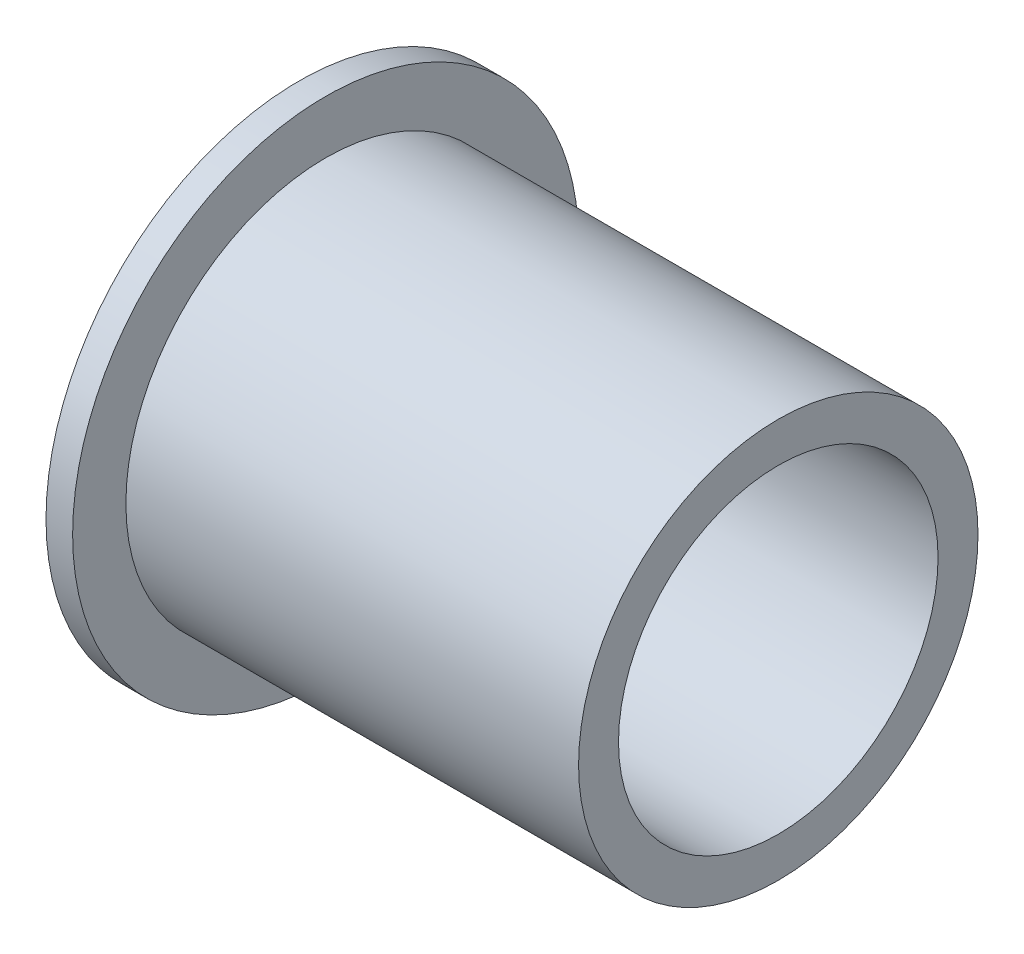
ISO-10303-21;
HEADER;
FILE_DESCRIPTION(('STEP AP214'),'2;1');
FILE_NAME('part.step','',(''),(''),'','','');
FILE_SCHEMA(('AUTOMOTIVE_DESIGN { 1 0 10303 214 1 1 1 1 }'));
ENDSEC;
DATA;
#1=APPLICATION_CONTEXT('core data for automotive mechanical design processes');
#2=APPLICATION_PROTOCOL_DEFINITION('international standard','automotive_design',2000,#1);
#3=PRODUCT_CONTEXT('',#1,'mechanical');
#4=PRODUCT('Part','Part','',(#3));
#5=PRODUCT_RELATED_PRODUCT_CATEGORY('part','',(#4));
#6=PRODUCT_DEFINITION_FORMATION('','',#4);
#7=PRODUCT_DEFINITION_CONTEXT('part definition',#1,'design');
#8=PRODUCT_DEFINITION('design','',#6,#7);
#9=PRODUCT_DEFINITION_SHAPE('','',#8);
#10=(LENGTH_UNIT() NAMED_UNIT(*) SI_UNIT(.MILLI.,.METRE.));
#11=(NAMED_UNIT(*) PLANE_ANGLE_UNIT() SI_UNIT($,.RADIAN.));
#12=(NAMED_UNIT(*) SI_UNIT($,.STERADIAN.) SOLID_ANGLE_UNIT());
#13=UNCERTAINTY_MEASURE_WITH_UNIT(LENGTH_MEASURE(1.E-05),#10,'distance_accuracy_value','');
#14=(GEOMETRIC_REPRESENTATION_CONTEXT(3) GLOBAL_UNCERTAINTY_ASSIGNED_CONTEXT((#13)) GLOBAL_UNIT_ASSIGNED_CONTEXT((#10,
#11,#12)) REPRESENTATION_CONTEXT('',''));
#15=CARTESIAN_POINT('',(0.,0.,0.));
#16=DIRECTION('',(0.,0.,1.));
#17=DIRECTION('',(1.,0.,0.));
#18=AXIS2_PLACEMENT_3D('',#15,#16,#17);
#19=CARTESIAN_POINT('',(0.,11.1125,0.));
#20=DIRECTION('',(1.,0.,0.));
#21=DIRECTION('',(0.,0.,-1.));
#22=AXIS2_PLACEMENT_3D('',#19,#20,#21);
#23=PLANE('',#22);
#24=CARTESIAN_POINT('',(0.,30.1625,0.));
#25=DIRECTION('',(1.,0.,0.));
#26=DIRECTION('',(0.,0.,-1.));
#27=AXIS2_PLACEMENT_3D('',#24,#25,#26);
#28=CIRCLE('',#27,30.1625);
#29=CARTESIAN_POINT('',(0.,30.1625,-30.1625));
#30=VERTEX_POINT('',#29);
#31=EDGE_CURVE('E10',#30,#30,#28,.T.);
#32=ORIENTED_EDGE('',*,*,#31,.F.);
#33=EDGE_LOOP('',(#32));
#34=FACE_BOUND('',#33,.T.);
#35=CARTESIAN_POINT('',(0.,30.1625,0.));
#36=DIRECTION('',(1.,0.,0.));
#37=DIRECTION('',(0.,0.,-1.));
#38=AXIS2_PLACEMENT_3D('',#35,#36,#37);
#39=CIRCLE('',#38,19.05);
#40=CARTESIAN_POINT('',(0.,30.1625,-19.05));
#41=VERTEX_POINT('',#40);
#42=EDGE_CURVE('E51',#41,#41,#39,.T.);
#43=ORIENTED_EDGE('',*,*,#42,.T.);
#44=EDGE_LOOP('',(#43));
#45=FACE_BOUND('',#44,.T.);
#46=ADVANCED_FACE('F29',(#34,#45),#23,.F.);
#47=CARTESIAN_POINT('',(57.15,30.1625,0.));
#48=DIRECTION('',(1.,0.,0.));
#49=DIRECTION('',(0.,0.,-1.));
#50=AXIS2_PLACEMENT_3D('',#47,#48,#49);
#51=CYLINDRICAL_SURFACE('',#50,30.1625);
#52=CARTESIAN_POINT('',(3.175,30.1625,0.));
#53=DIRECTION('',(1.,0.,0.));
#54=DIRECTION('',(0.,0.,-1.));
#55=AXIS2_PLACEMENT_3D('',#52,#53,#54);
#56=CIRCLE('',#55,30.1625);
#57=CARTESIAN_POINT('',(3.175,30.1625,-30.1625));
#58=VERTEX_POINT('',#57);
#59=EDGE_CURVE('E35',#58,#58,#56,.T.);
#60=ORIENTED_EDGE('',*,*,#59,.F.);
#61=EDGE_LOOP('',(#60));
#62=FACE_BOUND('',#61,.T.);
#63=ORIENTED_EDGE('',*,*,#31,.T.);
#64=EDGE_LOOP('',(#63));
#65=FACE_BOUND('',#64,.T.);
#66=ADVANCED_FACE('F76',(#62,#65),#51,.T.);
#67=CARTESIAN_POINT('',(3.175,0.,0.));
#68=DIRECTION('',(-1.,0.,0.));
#69=DIRECTION('',(0.,0.,1.));
#70=AXIS2_PLACEMENT_3D('',#67,#68,#69);
#71=PLANE('',#70);
#72=CARTESIAN_POINT('',(3.175,30.1625,0.));
#73=DIRECTION('',(1.,0.,0.));
#74=DIRECTION('',(0.,0.,-1.));
#75=AXIS2_PLACEMENT_3D('',#72,#73,#74);
#76=CIRCLE('',#75,23.8125);
#77=CARTESIAN_POINT('',(3.175,30.1625,-23.8125));
#78=VERTEX_POINT('',#77);
#79=EDGE_CURVE('E39',#78,#78,#76,.T.);
#80=ORIENTED_EDGE('',*,*,#79,.F.);
#81=EDGE_LOOP('',(#80));
#82=FACE_BOUND('',#81,.T.);
#83=ORIENTED_EDGE('',*,*,#59,.T.);
#84=EDGE_LOOP('',(#83));
#85=FACE_BOUND('',#84,.T.);
#86=ADVANCED_FACE('F71',(#82,#85),#71,.F.);
#87=CARTESIAN_POINT('',(57.15,30.1625,0.));
#88=DIRECTION('',(1.,0.,0.));
#89=DIRECTION('',(0.,0.,-1.));
#90=AXIS2_PLACEMENT_3D('',#87,#88,#89);
#91=CYLINDRICAL_SURFACE('',#90,23.8125);
#92=CARTESIAN_POINT('',(57.15,30.1625,0.));
#93=DIRECTION('',(1.,0.,0.));
#94=DIRECTION('',(0.,0.,-1.));
#95=AXIS2_PLACEMENT_3D('',#92,#93,#94);
#96=CIRCLE('',#95,23.8125);
#97=CARTESIAN_POINT('',(57.15,30.1625,-23.8125));
#98=VERTEX_POINT('',#97);
#99=EDGE_CURVE('E43',#98,#98,#96,.T.);
#100=ORIENTED_EDGE('',*,*,#99,.F.);
#101=EDGE_LOOP('',(#100));
#102=FACE_BOUND('',#101,.T.);
#103=ORIENTED_EDGE('',*,*,#79,.T.);
#104=EDGE_LOOP('',(#103));
#105=FACE_BOUND('',#104,.T.);
#106=ADVANCED_FACE('F65',(#102,#105),#91,.T.);
#107=CARTESIAN_POINT('',(57.15,6.35,0.));
#108=DIRECTION('',(-1.,0.,0.));
#109=DIRECTION('',(0.,0.,1.));
#110=AXIS2_PLACEMENT_3D('',#107,#108,#109);
#111=PLANE('',#110);
#112=CARTESIAN_POINT('',(57.15,30.1625,0.));
#113=DIRECTION('',(1.,0.,0.));
#114=DIRECTION('',(0.,0.,-1.));
#115=AXIS2_PLACEMENT_3D('',#112,#113,#114);
#116=CIRCLE('',#115,19.05);
#117=CARTESIAN_POINT('',(57.15,30.1625,-19.05));
#118=VERTEX_POINT('',#117);
#119=EDGE_CURVE('E48',#118,#118,#116,.T.);
#120=ORIENTED_EDGE('',*,*,#119,.F.);
#121=EDGE_LOOP('',(#120));
#122=FACE_BOUND('',#121,.T.);
#123=ORIENTED_EDGE('',*,*,#99,.T.);
#124=EDGE_LOOP('',(#123));
#125=FACE_BOUND('',#124,.T.);
#126=ADVANCED_FACE('F59',(#122,#125),#111,.F.);
#127=CARTESIAN_POINT('',(57.15,30.1625,0.));
#128=DIRECTION('',(1.,0.,0.));
#129=DIRECTION('',(0.,0.,-1.));
#130=AXIS2_PLACEMENT_3D('',#127,#128,#129);
#131=CYLINDRICAL_SURFACE('',#130,19.05);
#132=ORIENTED_EDGE('',*,*,#42,.F.);
#133=EDGE_LOOP('',(#132));
#134=FACE_BOUND('',#133,.T.);
#135=ORIENTED_EDGE('',*,*,#119,.T.);
#136=EDGE_LOOP('',(#135));
#137=FACE_BOUND('',#136,.T.);
#138=ADVANCED_FACE('F56',(#134,#137),#131,.F.);
#139=CLOSED_SHELL('',(#46,#66,#86,#106,#126,#138));
#140=MANIFOLD_SOLID_BREP('B2',#139);
#141=ADVANCED_BREP_SHAPE_REPRESENTATION('',(#18,#140),#14);
#142=SHAPE_DEFINITION_REPRESENTATION(#9,#141);
ENDSEC;
END-ISO-10303-21;
